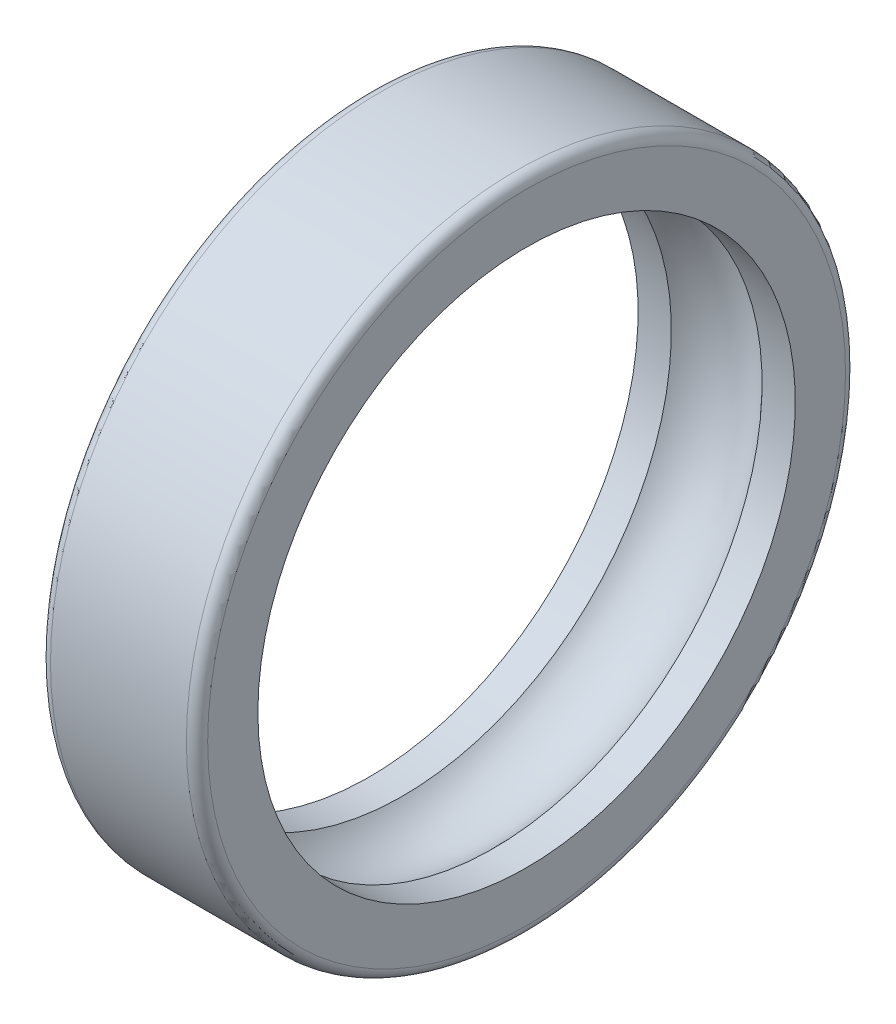
ISO-10303-21;
HEADER;
FILE_DESCRIPTION(('STEP AP214'),'2;1');
FILE_NAME('part.step','',(''),(''),'','','');
FILE_SCHEMA(('AUTOMOTIVE_DESIGN { 1 0 10303 214 1 1 1 1 }'));
ENDSEC;
DATA;
#1=APPLICATION_CONTEXT('core data for automotive mechanical design processes');
#2=APPLICATION_PROTOCOL_DEFINITION('international standard','automotive_design',2000,#1);
#3=PRODUCT_CONTEXT('',#1,'mechanical');
#4=PRODUCT('Part','Part','',(#3));
#5=PRODUCT_RELATED_PRODUCT_CATEGORY('part','',(#4));
#6=PRODUCT_DEFINITION_FORMATION('','',#4);
#7=PRODUCT_DEFINITION_CONTEXT('part definition',#1,'design');
#8=PRODUCT_DEFINITION('design','',#6,#7);
#9=PRODUCT_DEFINITION_SHAPE('','',#8);
#10=(LENGTH_UNIT() NAMED_UNIT(*) SI_UNIT(.MILLI.,.METRE.));
#11=(NAMED_UNIT(*) PLANE_ANGLE_UNIT() SI_UNIT($,.RADIAN.));
#12=(NAMED_UNIT(*) SI_UNIT($,.STERADIAN.) SOLID_ANGLE_UNIT());
#13=UNCERTAINTY_MEASURE_WITH_UNIT(LENGTH_MEASURE(1.E-05),#10,'distance_accuracy_value','');
#14=(GEOMETRIC_REPRESENTATION_CONTEXT(3) GLOBAL_UNCERTAINTY_ASSIGNED_CONTEXT((#13)) GLOBAL_UNIT_ASSIGNED_CONTEXT((#10,
#11,#12)) REPRESENTATION_CONTEXT('',''));
#15=CARTESIAN_POINT('',(0.,0.,0.));
#16=DIRECTION('',(0.,0.,1.));
#17=DIRECTION('',(1.,0.,0.));
#18=AXIS2_PLACEMENT_3D('',#15,#16,#17);
#19=CARTESIAN_POINT('',(-4.8952058204994,0.,0.));
#20=DIRECTION('',(-1.,0.,0.));
#21=DIRECTION('',(0.,0.,1.));
#22=AXIS2_PLACEMENT_3D('',#19,#20,#21);
#23=CYLINDRICAL_SURFACE('',#22,10.2311404622809);
#24=CARTESIAN_POINT('',(2.99212598425197,0.,0.));
#25=DIRECTION('',(-1.,0.,0.));
#26=DIRECTION('',(0.,0.,1.));
#27=AXIS2_PLACEMENT_3D('',#24,#25,#26);
#28=CIRCLE('',#27,10.2311404622809);
#29=CARTESIAN_POINT('',(2.99212598425197,0.,10.2311404622809));
#30=VERTEX_POINT('',#29);
#31=EDGE_CURVE('E66',#30,#30,#28,.T.);
#32=ORIENTED_EDGE('',*,*,#31,.F.);
#33=EDGE_LOOP('',(#32));
#34=FACE_BOUND('',#33,.T.);
#35=CARTESIAN_POINT('',(1.72660570271764,0.,0.));
#36=DIRECTION('',(-1.,0.,0.));
#37=DIRECTION('',(0.,0.,1.));
#38=AXIS2_PLACEMENT_3D('',#35,#36,#37);
#39=CIRCLE('',#38,10.2311404622809);
#40=CARTESIAN_POINT('',(1.72660570271764,0.,10.2311404622809));
#41=VERTEX_POINT('',#40);
#42=EDGE_CURVE('E57',#41,#41,#39,.T.);
#43=ORIENTED_EDGE('',*,*,#42,.T.);
#44=EDGE_LOOP('',(#43));
#45=FACE_BOUND('',#44,.T.);
#46=ADVANCED_FACE('F37',(#34,#45),#23,.F.);
#47=CARTESIAN_POINT('',(0.,0.,0.));
#48=DIRECTION('',(-1.,0.,0.));
#49=DIRECTION('',(0.,0.,1.));
#50=AXIS2_PLACEMENT_3D('',#47,#48,#49);
#51=TOROIDAL_SURFACE('',#50,8.68681737363475,2.31648463296927);
#52=ORIENTED_EDGE('',*,*,#42,.F.);
#53=EDGE_LOOP('',(#52));
#54=FACE_BOUND('',#53,.T.);
#55=CARTESIAN_POINT('',(-1.72660570271764,0.,0.));
#56=DIRECTION('',(-1.,0.,0.));
#57=DIRECTION('',(0.,0.,1.));
#58=AXIS2_PLACEMENT_3D('',#55,#56,#57);
#59=CIRCLE('',#58,10.2311404622809);
#60=CARTESIAN_POINT('',(-1.72660570271764,0.,10.2311404622809));
#61=VERTEX_POINT('',#60);
#62=EDGE_CURVE('E60',#61,#61,#59,.T.);
#63=ORIENTED_EDGE('',*,*,#62,.T.);
#64=EDGE_LOOP('',(#63));
#65=FACE_BOUND('',#64,.T.);
#66=ADVANCED_FACE('F74',(#54,#65),#51,.F.);
#67=CARTESIAN_POINT('',(-4.8952058204994,0.,0.));
#68=DIRECTION('',(-1.,0.,0.));
#69=DIRECTION('',(0.,0.,1.));
#70=AXIS2_PLACEMENT_3D('',#67,#68,#69);
#71=CYLINDRICAL_SURFACE('',#70,10.2311404622809);
#72=ORIENTED_EDGE('',*,*,#62,.F.);
#73=EDGE_LOOP('',(#72));
#74=FACE_BOUND('',#73,.T.);
#75=CARTESIAN_POINT('',(-2.99212598425197,0.,0.));
#76=DIRECTION('',(-1.,0.,0.));
#77=DIRECTION('',(0.,0.,1.));
#78=AXIS2_PLACEMENT_3D('',#75,#76,#77);
#79=CIRCLE('',#78,10.2311404622809);
#80=CARTESIAN_POINT('',(-2.99212598425197,0.,10.2311404622809));
#81=VERTEX_POINT('',#80);
#82=EDGE_CURVE('E63',#81,#81,#79,.T.);
#83=ORIENTED_EDGE('',*,*,#82,.T.);
#84=EDGE_LOOP('',(#83));
#85=FACE_BOUND('',#84,.T.);
#86=ADVANCED_FACE('F80',(#74,#85),#71,.F.);
#87=CARTESIAN_POINT('',(-2.99212598425197,12.5476250952502,0.));
#88=DIRECTION('',(1.,0.,0.));
#89=DIRECTION('',(0.,0.,-1.));
#90=AXIS2_PLACEMENT_3D('',#87,#88,#89);
#91=PLANE('',#90);
#92=CARTESIAN_POINT('',(-2.99212598425197,0.,0.));
#93=DIRECTION('',(1.,0.,0.));
#94=DIRECTION('',(0.,0.,-1.));
#95=AXIS2_PLACEMENT_3D('',#92,#93,#94);
#96=CIRCLE('',#95,12.1422402844806);
#97=CARTESIAN_POINT('',(-2.99212598425197,0.,-12.1422402844806));
#98=VERTEX_POINT('',#97);
#99=EDGE_CURVE('E10',#98,#98,#96,.F.);
#100=ORIENTED_EDGE('',*,*,#99,.T.);
#101=EDGE_LOOP('',(#100));
#102=FACE_BOUND('',#101,.T.);
#103=ORIENTED_EDGE('',*,*,#82,.F.);
#104=EDGE_LOOP('',(#103));
#105=FACE_BOUND('',#104,.T.);
#106=ADVANCED_FACE('F86',(#102,#105),#91,.F.);
#107=CARTESIAN_POINT('',(-4.8952058204994,0.,0.));
#108=DIRECTION('',(-1.,0.,0.));
#109=DIRECTION('',(0.,0.,1.));
#110=AXIS2_PLACEMENT_3D('',#107,#108,#109);
#111=CYLINDRICAL_SURFACE('',#110,12.5476250952502);
#112=CARTESIAN_POINT('',(2.58674117348235,0.,0.));
#113=DIRECTION('',(-1.,0.,0.));
#114=DIRECTION('',(0.,0.,1.));
#115=AXIS2_PLACEMENT_3D('',#112,#113,#114);
#116=CIRCLE('',#115,12.5476250952502);
#117=CARTESIAN_POINT('',(2.58674117348235,0.,12.5476250952502));
#118=VERTEX_POINT('',#117);
#119=EDGE_CURVE('E48',#118,#118,#116,.T.);
#120=ORIENTED_EDGE('',*,*,#119,.T.);
#121=EDGE_LOOP('',(#120));
#122=FACE_BOUND('',#121,.T.);
#123=CARTESIAN_POINT('',(-2.58674117348235,0.,0.));
#124=DIRECTION('',(1.,0.,0.));
#125=DIRECTION('',(0.,0.,-1.));
#126=AXIS2_PLACEMENT_3D('',#123,#124,#125);
#127=CIRCLE('',#126,12.5476250952502);
#128=CARTESIAN_POINT('',(-2.58674117348235,0.,-12.5476250952502));
#129=VERTEX_POINT('',#128);
#130=EDGE_CURVE('E52',#129,#129,#127,.T.);
#131=ORIENTED_EDGE('',*,*,#130,.T.);
#132=EDGE_LOOP('',(#131));
#133=FACE_BOUND('',#132,.T.);
#134=ADVANCED_FACE('F91',(#122,#133),#111,.T.);
#135=CARTESIAN_POINT('',(2.99212598425197,12.5476250952502,0.));
#136=DIRECTION('',(-1.,0.,0.));
#137=DIRECTION('',(0.,0.,1.));
#138=AXIS2_PLACEMENT_3D('',#135,#136,#137);
#139=PLANE('',#138);
#140=CARTESIAN_POINT('',(2.99212598425197,0.,0.));
#141=DIRECTION('',(-1.,0.,0.));
#142=DIRECTION('',(0.,0.,1.));
#143=AXIS2_PLACEMENT_3D('',#140,#141,#142);
#144=CIRCLE('',#143,12.1422402844806);
#145=CARTESIAN_POINT('',(2.99212598425197,0.,12.1422402844806));
#146=VERTEX_POINT('',#145);
#147=EDGE_CURVE('E44',#146,#146,#144,.F.);
#148=ORIENTED_EDGE('',*,*,#147,.T.);
#149=EDGE_LOOP('',(#148));
#150=FACE_BOUND('',#149,.T.);
#151=ORIENTED_EDGE('',*,*,#31,.T.);
#152=EDGE_LOOP('',(#151));
#153=FACE_BOUND('',#152,.T.);
#154=ADVANCED_FACE('F70',(#150,#153),#139,.F.);
#155=CARTESIAN_POINT('',(2.58674117348235,0.,0.));
#156=DIRECTION('',(-1.,0.,0.));
#157=DIRECTION('',(0.,0.,1.));
#158=AXIS2_PLACEMENT_3D('',#155,#156,#157);
#159=TOROIDAL_SURFACE('',#158,12.1422402844806,0.405384810769622);
#160=ORIENTED_EDGE('',*,*,#147,.F.);
#161=EDGE_LOOP('',(#160));
#162=FACE_BOUND('',#161,.T.);
#163=ORIENTED_EDGE('',*,*,#119,.F.);
#164=EDGE_LOOP('',(#163));
#165=FACE_BOUND('',#164,.T.);
#166=ADVANCED_FACE('F99',(#162,#165),#159,.T.);
#167=CARTESIAN_POINT('',(-2.58674117348235,0.,0.));
#168=DIRECTION('',(1.,0.,0.));
#169=DIRECTION('',(0.,0.,-1.));
#170=AXIS2_PLACEMENT_3D('',#167,#168,#169);
#171=TOROIDAL_SURFACE('',#170,12.1422402844806,0.405384810769622);
#172=ORIENTED_EDGE('',*,*,#130,.F.);
#173=EDGE_LOOP('',(#172));
#174=FACE_BOUND('',#173,.T.);
#175=ORIENTED_EDGE('',*,*,#99,.F.);
#176=EDGE_LOOP('',(#175));
#177=FACE_BOUND('',#176,.T.);
#178=ADVANCED_FACE('F39',(#174,#177),#171,.T.);
#179=CLOSED_SHELL('',(#46,#66,#86,#106,#134,#154,#166,#178));
#180=MANIFOLD_SOLID_BREP('B2',#179);
#181=ADVANCED_BREP_SHAPE_REPRESENTATION('',(#18,#180),#14);
#182=SHAPE_DEFINITION_REPRESENTATION(#9,#181);
ENDSEC;
END-ISO-10303-21;
